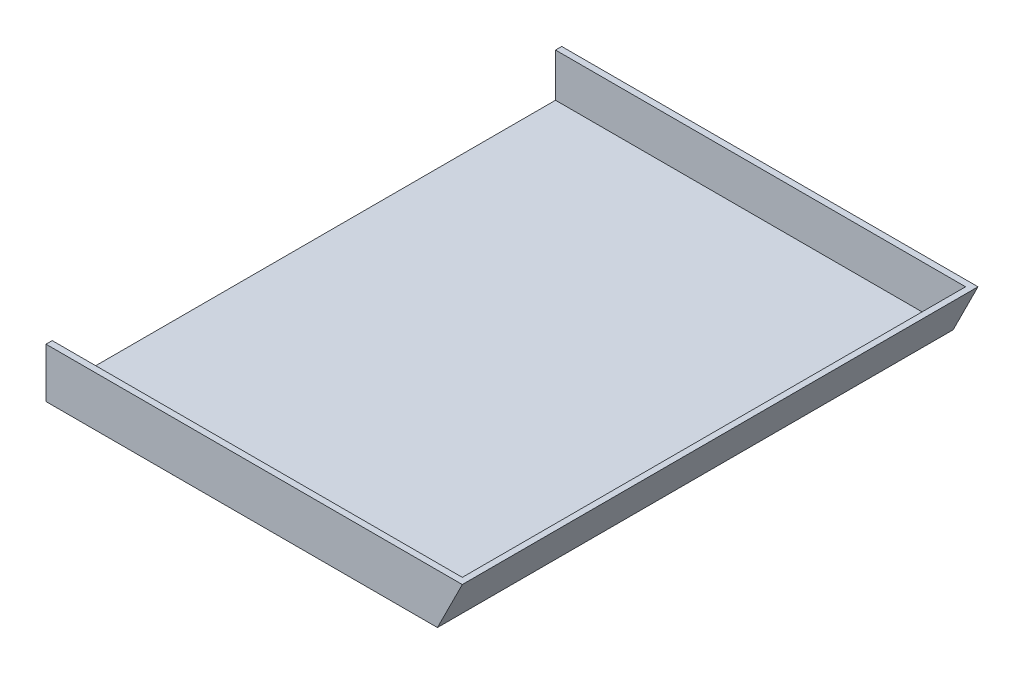
ISO-10303-21;
HEADER;
FILE_DESCRIPTION(('STEP AP214'),'2;1');
FILE_NAME('part.step','',(''),(''),'','','');
FILE_SCHEMA(('AUTOMOTIVE_DESIGN { 1 0 10303 214 1 1 1 1 }'));
ENDSEC;
DATA;
#1=APPLICATION_CONTEXT('core data for automotive mechanical design processes');
#2=APPLICATION_PROTOCOL_DEFINITION('international standard','automotive_design',2000,#1);
#3=PRODUCT_CONTEXT('',#1,'mechanical');
#4=PRODUCT('Part','Part','',(#3));
#5=PRODUCT_RELATED_PRODUCT_CATEGORY('part','',(#4));
#6=PRODUCT_DEFINITION_FORMATION('','',#4);
#7=PRODUCT_DEFINITION_CONTEXT('part definition',#1,'design');
#8=PRODUCT_DEFINITION('design','',#6,#7);
#9=PRODUCT_DEFINITION_SHAPE('','',#8);
#10=(LENGTH_UNIT() NAMED_UNIT(*) SI_UNIT(.MILLI.,.METRE.));
#11=(NAMED_UNIT(*) PLANE_ANGLE_UNIT() SI_UNIT($,.RADIAN.));
#12=(NAMED_UNIT(*) SI_UNIT($,.STERADIAN.) SOLID_ANGLE_UNIT());
#13=UNCERTAINTY_MEASURE_WITH_UNIT(LENGTH_MEASURE(1.E-05),#10,'distance_accuracy_value','');
#14=(GEOMETRIC_REPRESENTATION_CONTEXT(3) GLOBAL_UNCERTAINTY_ASSIGNED_CONTEXT((#13)) GLOBAL_UNIT_ASSIGNED_CONTEXT((#10,
#11,#12)) REPRESENTATION_CONTEXT('',''));
#15=CARTESIAN_POINT('',(0.,0.,0.));
#16=DIRECTION('',(0.,0.,1.));
#17=DIRECTION('',(1.,0.,0.));
#18=AXIS2_PLACEMENT_3D('',#15,#16,#17);
#19=CARTESIAN_POINT('',(3.4,6.49999999999998,44.5));
#20=DIRECTION('',(1.,0.,0.));
#21=DIRECTION('',(0.,0.,-1.));
#22=AXIS2_PLACEMENT_3D('',#19,#20,#21);
#23=PLANE('',#22);
#24=DIRECTION('',(0.,0.,1.));
#25=VECTOR('',#24,1.);
#26=CARTESIAN_POINT('',(3.4,13.5,44.5));
#27=LINE('',#26,#25);
#28=CARTESIAN_POINT('',(3.4,13.5,44.5));
#29=VERTEX_POINT('',#28);
#30=CARTESIAN_POINT('',(3.4,13.5,51.));
#31=VERTEX_POINT('',#30);
#32=EDGE_CURVE('E232',#29,#31,#27,.T.);
#33=ORIENTED_EDGE('',*,*,#32,.T.);
#34=DIRECTION('',(0.,1.,0.));
#35=VECTOR('',#34,1.);
#36=CARTESIAN_POINT('',(3.4,13.5,51.));
#37=LINE('',#36,#35);
#38=CARTESIAN_POINT('',(3.4,6.49999999999998,51.));
#39=VERTEX_POINT('',#38);
#40=EDGE_CURVE('E217',#39,#31,#37,.T.);
#41=ORIENTED_EDGE('',*,*,#40,.F.);
#42=DIRECTION('',(0.,0.,1.));
#43=VECTOR('',#42,1.);
#44=CARTESIAN_POINT('',(3.4,6.49999999999998,44.5));
#45=LINE('',#44,#43);
#46=CARTESIAN_POINT('',(3.4,6.49999999999998,44.5));
#47=VERTEX_POINT('',#46);
#48=EDGE_CURVE('E233',#47,#39,#45,.T.);
#49=ORIENTED_EDGE('',*,*,#48,.F.);
#50=DIRECTION('',(0.,1.,0.));
#51=VECTOR('',#50,1.);
#52=CARTESIAN_POINT('',(3.4,6.49999999999998,44.5));
#53=LINE('',#52,#51);
#54=EDGE_CURVE('E220',#47,#29,#53,.T.);
#55=ORIENTED_EDGE('',*,*,#54,.T.);
#56=EDGE_LOOP('',(#33,#41,#49,#55));
#57=FACE_BOUND('',#56,.T.);
#58=ADVANCED_FACE('F37',(#57),#23,.T.);
#59=CARTESIAN_POINT('',(3.4,6.49999999999998,44.5));
#60=DIRECTION('',(0.,-1.,0.));
#61=DIRECTION('',(0.,0.,-1.));
#62=AXIS2_PLACEMENT_3D('',#59,#60,#61);
#63=PLANE('',#62);
#64=DIRECTION('',(0.,0.,1.));
#65=VECTOR('',#64,1.);
#66=CARTESIAN_POINT('',(2.75,6.49999999999998,49.1));
#67=LINE('',#66,#65);
#68=CARTESIAN_POINT('',(2.75,6.49999999999998,46.4));
#69=VERTEX_POINT('',#68);
#70=CARTESIAN_POINT('',(2.75,6.49999999999998,49.1));
#71=VERTEX_POINT('',#70);
#72=EDGE_CURVE('E53',#69,#71,#67,.T.);
#73=ORIENTED_EDGE('',*,*,#72,.F.);
#74=DIRECTION('',(1.,0.,0.));
#75=VECTOR('',#74,1.);
#76=CARTESIAN_POINT('',(-2.75,6.49999999999998,46.4));
#77=LINE('',#76,#75);
#78=CARTESIAN_POINT('',(-2.75,6.49999999999998,46.4));
#79=VERTEX_POINT('',#78);
#80=EDGE_CURVE('E195',#79,#69,#77,.T.);
#81=ORIENTED_EDGE('',*,*,#80,.F.);
#82=DIRECTION('',(0.,0.,-1.));
#83=VECTOR('',#82,1.);
#84=CARTESIAN_POINT('',(-2.75,6.49999999999998,49.1));
#85=LINE('',#84,#83);
#86=CARTESIAN_POINT('',(-2.75,6.49999999999998,49.1));
#87=VERTEX_POINT('',#86);
#88=EDGE_CURVE('E198',#87,#79,#85,.T.);
#89=ORIENTED_EDGE('',*,*,#88,.F.);
#90=DIRECTION('',(-1.,0.,0.));
#91=VECTOR('',#90,1.);
#92=CARTESIAN_POINT('',(-2.75,6.49999999999998,49.1));
#93=LINE('',#92,#91);
#94=EDGE_CURVE('E204',#71,#87,#93,.T.);
#95=ORIENTED_EDGE('',*,*,#94,.F.);
#96=EDGE_LOOP('',(#73,#81,#89,#95));
#97=FACE_BOUND('',#96,.T.);
#98=ORIENTED_EDGE('',*,*,#48,.T.);
#99=DIRECTION('',(1.,0.,0.));
#100=VECTOR('',#99,1.);
#101=CARTESIAN_POINT('',(-3.4,6.49999999999998,51.));
#102=LINE('',#101,#100);
#103=CARTESIAN_POINT('',(-3.4,6.49999999999998,51.));
#104=VERTEX_POINT('',#103);
#105=EDGE_CURVE('E215',#104,#39,#102,.T.);
#106=ORIENTED_EDGE('',*,*,#105,.F.);
#107=DIRECTION('',(0.,0.,1.));
#108=VECTOR('',#107,1.);
#109=CARTESIAN_POINT('',(-3.4,6.49999999999998,44.5));
#110=LINE('',#109,#108);
#111=CARTESIAN_POINT('',(-3.4,6.49999999999998,44.5));
#112=VERTEX_POINT('',#111);
#113=EDGE_CURVE('E237',#112,#104,#110,.T.);
#114=ORIENTED_EDGE('',*,*,#113,.F.);
#115=DIRECTION('',(1.,0.,0.));
#116=VECTOR('',#115,1.);
#117=CARTESIAN_POINT('',(3.4,6.49999999999998,44.5));
#118=LINE('',#117,#116);
#119=EDGE_CURVE('E229',#112,#47,#118,.T.);
#120=ORIENTED_EDGE('',*,*,#119,.T.);
#121=EDGE_LOOP('',(#98,#106,#114,#120));
#122=FACE_BOUND('',#121,.T.);
#123=ADVANCED_FACE('F406',(#97,#122),#63,.T.);
#124=CARTESIAN_POINT('',(-3.4,6.49999999999998,44.5));
#125=DIRECTION('',(-1.,0.,0.));
#126=DIRECTION('',(0.,0.,1.));
#127=AXIS2_PLACEMENT_3D('',#124,#125,#126);
#128=PLANE('',#127);
#129=ORIENTED_EDGE('',*,*,#113,.T.);
#130=DIRECTION('',(0.,-1.,0.));
#131=VECTOR('',#130,1.);
#132=CARTESIAN_POINT('',(-3.4,13.5,51.));
#133=LINE('',#132,#131);
#134=CARTESIAN_POINT('',(-3.4,13.5,51.));
#135=VERTEX_POINT('',#134);
#136=EDGE_CURVE('E210',#135,#104,#133,.T.);
#137=ORIENTED_EDGE('',*,*,#136,.F.);
#138=DIRECTION('',(0.,0.,1.));
#139=VECTOR('',#138,1.);
#140=CARTESIAN_POINT('',(-3.4,13.5,44.5));
#141=LINE('',#140,#139);
#142=CARTESIAN_POINT('',(-3.4,13.5,44.5));
#143=VERTEX_POINT('',#142);
#144=EDGE_CURVE('E240',#143,#135,#141,.T.);
#145=ORIENTED_EDGE('',*,*,#144,.F.);
#146=DIRECTION('',(0.,-1.,0.));
#147=VECTOR('',#146,1.);
#148=CARTESIAN_POINT('',(-3.4,6.49999999999998,44.5));
#149=LINE('',#148,#147);
#150=EDGE_CURVE('E226',#143,#112,#149,.T.);
#151=ORIENTED_EDGE('',*,*,#150,.T.);
#152=EDGE_LOOP('',(#129,#137,#145,#151));
#153=FACE_BOUND('',#152,.T.);
#154=ADVANCED_FACE('F411',(#153),#128,.T.);
#155=CARTESIAN_POINT('',(-3.4,0.,83.));
#156=DIRECTION('',(-1.,0.,0.));
#157=DIRECTION('',(0.,-1.,0.));
#158=AXIS2_PLACEMENT_3D('',#155,#156,#157);
#159=PLANE('',#158);
#160=DIRECTION('',(0.,0.,-1.));
#161=VECTOR('',#160,1.);
#162=CARTESIAN_POINT('',(-3.4,0.,83.));
#163=LINE('',#162,#161);
#164=CARTESIAN_POINT('',(-3.4,0.,4.));
#165=VERTEX_POINT('',#164);
#166=CARTESIAN_POINT('',(-3.4,0.,0.));
#167=VERTEX_POINT('',#166);
#168=EDGE_CURVE('E321',#165,#167,#163,.T.);
#169=ORIENTED_EDGE('',*,*,#168,.F.);
#170=DIRECTION('',(0.,-1.,0.));
#171=VECTOR('',#170,1.);
#172=CARTESIAN_POINT('',(-3.4,13.5,4.));
#173=LINE('',#172,#171);
#174=CARTESIAN_POINT('',(-3.4,13.5,4.));
#175=VERTEX_POINT('',#174);
#176=EDGE_CURVE('E236',#175,#165,#173,.T.);
#177=ORIENTED_EDGE('',*,*,#176,.F.);
#178=DIRECTION('',(0.,0.,-1.));
#179=VECTOR('',#178,1.);
#180=CARTESIAN_POINT('',(-3.4,13.5,83.));
#181=LINE('',#180,#179);
#182=CARTESIAN_POINT('',(-3.4,13.5,0.));
#183=VERTEX_POINT('',#182);
#184=EDGE_CURVE('E323',#175,#183,#181,.T.);
#185=ORIENTED_EDGE('',*,*,#184,.T.);
#186=DIRECTION('',(0.,1.,0.));
#187=VECTOR('',#186,1.);
#188=CARTESIAN_POINT('',(-3.4,0.,0.));
#189=LINE('',#188,#187);
#190=EDGE_CURVE('E297',#167,#183,#189,.T.);
#191=ORIENTED_EDGE('',*,*,#190,.F.);
#192=EDGE_LOOP('',(#169,#177,#185,#191));
#193=FACE_BOUND('',#192,.T.);
#194=ADVANCED_FACE('F387',(#193),#159,.T.);
#195=CARTESIAN_POINT('',(0.,0.,83.));
#196=DIRECTION('',(0.,0.,-1.));
#197=DIRECTION('',(-1.,0.,0.));
#198=AXIS2_PLACEMENT_3D('',#195,#196,#197);
#199=CYLINDRICAL_SURFACE('',#198,3.4);
#200=CARTESIAN_POINT('',(0.,0.,4.));
#201=DIRECTION('',(0.,0.,1.));
#202=DIRECTION('',(1.,0.,0.));
#203=AXIS2_PLACEMENT_3D('',#200,#201,#202);
#204=CIRCLE('',#203,3.4);
#205=CARTESIAN_POINT('',(3.4,0.,4.));
#206=VERTEX_POINT('',#205);
#207=EDGE_CURVE('E250',#165,#206,#204,.T.);
#208=ORIENTED_EDGE('',*,*,#207,.F.);
#209=ORIENTED_EDGE('',*,*,#168,.T.);
#210=CARTESIAN_POINT('',(0.,0.,0.));
#211=DIRECTION('',(0.,0.,1.));
#212=DIRECTION('',(1.,0.,0.));
#213=AXIS2_PLACEMENT_3D('',#210,#211,#212);
#214=CIRCLE('',#213,3.4);
#215=CARTESIAN_POINT('',(3.4,0.,0.));
#216=VERTEX_POINT('',#215);
#217=EDGE_CURVE('E300',#167,#216,#214,.T.);
#218=ORIENTED_EDGE('',*,*,#217,.T.);
#219=DIRECTION('',(0.,0.,-1.));
#220=VECTOR('',#219,1.);
#221=CARTESIAN_POINT('',(3.4,0.,83.));
#222=LINE('',#221,#220);
#223=EDGE_CURVE('E319',#206,#216,#222,.T.);
#224=ORIENTED_EDGE('',*,*,#223,.F.);
#225=EDGE_LOOP('',(#208,#209,#218,#224));
#226=FACE_BOUND('',#225,.T.);
#227=ADVANCED_FACE('F383',(#226),#199,.T.);
#228=CARTESIAN_POINT('',(3.4,0.,83.));
#229=DIRECTION('',(1.,0.,0.));
#230=DIRECTION('',(0.,1.,0.));
#231=AXIS2_PLACEMENT_3D('',#228,#229,#230);
#232=PLANE('',#231);
#233=DIRECTION('',(0.,0.,-1.));
#234=VECTOR('',#233,1.);
#235=CARTESIAN_POINT('',(3.4,13.5,83.));
#236=LINE('',#235,#234);
#237=CARTESIAN_POINT('',(3.4,13.5,4.));
#238=VERTEX_POINT('',#237);
#239=CARTESIAN_POINT('',(3.4,13.5,0.));
#240=VERTEX_POINT('',#239);
#241=EDGE_CURVE('E317',#238,#240,#236,.T.);
#242=ORIENTED_EDGE('',*,*,#241,.F.);
#243=DIRECTION('',(0.,1.,0.));
#244=VECTOR('',#243,1.);
#245=CARTESIAN_POINT('',(3.4,13.5,4.));
#246=LINE('',#245,#244);
#247=EDGE_CURVE('E246',#206,#238,#246,.T.);
#248=ORIENTED_EDGE('',*,*,#247,.F.);
#249=ORIENTED_EDGE('',*,*,#223,.T.);
#250=DIRECTION('',(0.,-1.,0.));
#251=VECTOR('',#250,1.);
#252=CARTESIAN_POINT('',(3.4,0.,0.));
#253=LINE('',#252,#251);
#254=EDGE_CURVE('E303',#240,#216,#253,.T.);
#255=ORIENTED_EDGE('',*,*,#254,.F.);
#256=EDGE_LOOP('',(#242,#248,#249,#255));
#257=FACE_BOUND('',#256,.T.);
#258=ADVANCED_FACE('F378',(#257),#232,.T.);
#259=CARTESIAN_POINT('',(0.,0.,83.));
#260=DIRECTION('',(0.,0.,-1.));
#261=DIRECTION('',(-1.,0.,0.));
#262=AXIS2_PLACEMENT_3D('',#259,#260,#261);
#263=CYLINDRICAL_SURFACE('',#262,1.5);
#264=CARTESIAN_POINT('',(0.,0.,0.));
#265=DIRECTION('',(0.,0.,1.));
#266=DIRECTION('',(1.,0.,0.));
#267=AXIS2_PLACEMENT_3D('',#264,#265,#266);
#268=CIRCLE('',#267,1.5);
#269=CARTESIAN_POINT('',(1.5,0.,0.));
#270=VERTEX_POINT('',#269);
#271=EDGE_CURVE('E283',#270,#270,#268,.T.);
#272=ORIENTED_EDGE('',*,*,#271,.F.);
#273=EDGE_LOOP('',(#272));
#274=FACE_BOUND('',#273,.T.);
#275=CARTESIAN_POINT('',(0.,0.,4.));
#276=DIRECTION('',(0.,0.,1.));
#277=DIRECTION('',(1.,0.,0.));
#278=AXIS2_PLACEMENT_3D('',#275,#276,#277);
#279=CIRCLE('',#278,1.5);
#280=CARTESIAN_POINT('',(1.5,0.,4.));
#281=VERTEX_POINT('',#280);
#282=EDGE_CURVE('E41',#281,#281,#279,.T.);
#283=ORIENTED_EDGE('',*,*,#282,.T.);
#284=EDGE_LOOP('',(#283));
#285=FACE_BOUND('',#284,.T.);
#286=ADVANCED_FACE('F558',(#274,#285),#263,.F.);
#287=CARTESIAN_POINT('',(17.4,-8.7,83.));
#288=DIRECTION('',(-0.894427190999916,0.447213595499958,0.));
#289=DIRECTION('',(-0.447213595499959,-0.894427190999916,0.));
#290=AXIS2_PLACEMENT_3D('',#287,#288,#289);
#291=PLANE('',#290);
#292=DIRECTION('',(0.,0.,-1.));
#293=VECTOR('',#292,1.);
#294=CARTESIAN_POINT('',(32.5,21.5,83.));
#295=LINE('',#294,#293);
#296=CARTESIAN_POINT('',(32.5,21.5,82.));
#297=VERTEX_POINT('',#296);
#298=CARTESIAN_POINT('',(32.5,21.5,1.));
#299=VERTEX_POINT('',#298);
#300=EDGE_CURVE('E11',#297,#299,#295,.T.);
#301=ORIENTED_EDGE('',*,*,#300,.T.);
#302=DIRECTION('',(-0.447213595499959,-0.894427190999916,0.));
#303=VECTOR('',#302,1.);
#304=CARTESIAN_POINT('',(17.4,-8.7,1.));
#305=LINE('',#304,#303);
#306=CARTESIAN_POINT('',(29.,14.5,1.));
#307=VERTEX_POINT('',#306);
#308=EDGE_CURVE('E257',#299,#307,#305,.T.);
#309=ORIENTED_EDGE('',*,*,#308,.T.);
#310=DIRECTION('',(0.,0.,-1.));
#311=VECTOR('',#310,1.);
#312=CARTESIAN_POINT('',(29.,14.5,83.));
#313=LINE('',#312,#311);
#314=CARTESIAN_POINT('',(29.,14.5,82.));
#315=VERTEX_POINT('',#314);
#316=EDGE_CURVE('E46',#315,#307,#313,.T.);
#317=ORIENTED_EDGE('',*,*,#316,.F.);
#318=DIRECTION('',(-0.447213595499959,-0.894427190999916,0.));
#319=VECTOR('',#318,1.);
#320=CARTESIAN_POINT('',(17.4,-8.7,82.));
#321=LINE('',#320,#319);
#322=EDGE_CURVE('E276',#297,#315,#321,.T.);
#323=ORIENTED_EDGE('',*,*,#322,.F.);
#324=EDGE_LOOP('',(#301,#309,#317,#323));
#325=FACE_BOUND('',#324,.T.);
#326=ADVANCED_FACE('F338',(#325),#291,.T.);
#327=CARTESIAN_POINT('',(0.,14.5,83.));
#328=DIRECTION('',(0.,1.,0.));
#329=DIRECTION('',(0.,0.,1.));
#330=AXIS2_PLACEMENT_3D('',#327,#328,#329);
#331=PLANE('',#330);
#332=ORIENTED_EDGE('',*,*,#316,.T.);
#333=DIRECTION('',(1.,0.,0.));
#334=VECTOR('',#333,1.);
#335=CARTESIAN_POINT('',(-33.5,14.5,1.));
#336=LINE('',#335,#334);
#337=CARTESIAN_POINT('',(-33.5,14.5,1.));
#338=VERTEX_POINT('',#337);
#339=EDGE_CURVE('E255',#338,#307,#336,.T.);
#340=ORIENTED_EDGE('',*,*,#339,.F.);
#341=DIRECTION('',(0.,0.,-1.));
#342=VECTOR('',#341,1.);
#343=CARTESIAN_POINT('',(-33.5,14.5,83.));
#344=LINE('',#343,#342);
#345=CARTESIAN_POINT('',(-33.5,14.5,82.));
#346=VERTEX_POINT('',#345);
#347=EDGE_CURVE('E328',#346,#338,#344,.T.);
#348=ORIENTED_EDGE('',*,*,#347,.F.);
#349=DIRECTION('',(1.,0.,0.));
#350=VECTOR('',#349,1.);
#351=CARTESIAN_POINT('',(0.,14.5,82.));
#352=LINE('',#351,#350);
#353=EDGE_CURVE('E265',#346,#315,#352,.T.);
#354=ORIENTED_EDGE('',*,*,#353,.T.);
#355=EDGE_LOOP('',(#332,#340,#348,#354));
#356=FACE_BOUND('',#355,.T.);
#357=ADVANCED_FACE('F335',(#356),#331,.T.);
#358=CARTESIAN_POINT('',(18.2,-9.1,83.));
#359=DIRECTION('',(0.894427190999916,-0.447213595499958,0.));
#360=DIRECTION('',(0.447213595499958,0.894427190999916,0.));
#361=AXIS2_PLACEMENT_3D('',#358,#359,#360);
#362=PLANE('',#361);
#363=DIRECTION('',(-0.447213595499958,-0.894427190999916,0.));
#364=VECTOR('',#363,1.);
#365=CARTESIAN_POINT('',(18.2,-9.1,0.));
#366=LINE('',#365,#364);
#367=CARTESIAN_POINT('',(33.5,21.5,0.));
#368=VERTEX_POINT('',#367);
#369=CARTESIAN_POINT('',(29.5,13.5,0.));
#370=VERTEX_POINT('',#369);
#371=EDGE_CURVE('E309',#368,#370,#366,.T.);
#372=ORIENTED_EDGE('',*,*,#371,.F.);
#373=DIRECTION('',(0.,0.,-1.));
#374=VECTOR('',#373,1.);
#375=CARTESIAN_POINT('',(33.5,21.5,83.));
#376=LINE('',#375,#374);
#377=CARTESIAN_POINT('',(33.5,21.5,83.));
#378=VERTEX_POINT('',#377);
#379=EDGE_CURVE('E290',#378,#368,#376,.T.);
#380=ORIENTED_EDGE('',*,*,#379,.F.);
#381=DIRECTION('',(-0.447213595499958,-0.894427190999916,0.));
#382=VECTOR('',#381,1.);
#383=CARTESIAN_POINT('',(18.2,-9.1,83.));
#384=LINE('',#383,#382);
#385=CARTESIAN_POINT('',(29.5,13.5,83.));
#386=VERTEX_POINT('',#385);
#387=EDGE_CURVE('E287',#378,#386,#384,.T.);
#388=ORIENTED_EDGE('',*,*,#387,.T.);
#389=DIRECTION('',(0.,0.,-1.));
#390=VECTOR('',#389,1.);
#391=CARTESIAN_POINT('',(29.5,13.5,83.));
#392=LINE('',#391,#390);
#393=EDGE_CURVE('E314',#386,#370,#392,.T.);
#394=ORIENTED_EDGE('',*,*,#393,.T.);
#395=EDGE_LOOP('',(#372,#380,#388,#394));
#396=FACE_BOUND('',#395,.T.);
#397=ADVANCED_FACE('F362',(#396),#362,.T.);
#398=CARTESIAN_POINT('',(-1.49186218934004E-13,21.4999999999998,83.));
#399=DIRECTION('',(0.,-1.,0.));
#400=DIRECTION('',(1.,0.,0.));
#401=AXIS2_PLACEMENT_3D('',#398,#399,#400);
#402=PLANE('',#401);
#403=DIRECTION('',(-1.,0.,0.));
#404=VECTOR('',#403,1.);
#405=CARTESIAN_POINT('',(-1.49186218934004E-13,21.4999999999998,0.));
#406=LINE('',#405,#404);
#407=CARTESIAN_POINT('',(-33.5,21.5,0.));
#408=VERTEX_POINT('',#407);
#409=EDGE_CURVE('E279',#368,#408,#406,.T.);
#410=ORIENTED_EDGE('',*,*,#409,.T.);
#411=DIRECTION('',(0.,0.,1.));
#412=VECTOR('',#411,1.);
#413=CARTESIAN_POINT('',(-33.5,21.5,0.));
#414=LINE('',#413,#412);
#415=CARTESIAN_POINT('',(-33.5,21.5,1.));
#416=VERTEX_POINT('',#415);
#417=EDGE_CURVE('E258',#408,#416,#414,.T.);
#418=ORIENTED_EDGE('',*,*,#417,.T.);
#419=DIRECTION('',(1.,0.,0.));
#420=VECTOR('',#419,1.);
#421=CARTESIAN_POINT('',(-33.5,21.5,1.));
#422=LINE('',#421,#420);
#423=EDGE_CURVE('E254',#416,#299,#422,.T.);
#424=ORIENTED_EDGE('',*,*,#423,.T.);
#425=ORIENTED_EDGE('',*,*,#300,.F.);
#426=DIRECTION('',(1.,0.,0.));
#427=VECTOR('',#426,1.);
#428=CARTESIAN_POINT('',(0.,21.5,82.));
#429=LINE('',#428,#427);
#430=CARTESIAN_POINT('',(-33.5,21.5,82.));
#431=VERTEX_POINT('',#430);
#432=EDGE_CURVE('E266',#431,#297,#429,.T.);
#433=ORIENTED_EDGE('',*,*,#432,.F.);
#434=DIRECTION('',(0.,0.,1.));
#435=VECTOR('',#434,1.);
#436=CARTESIAN_POINT('',(-33.5,21.5,0.));
#437=LINE('',#436,#435);
#438=CARTESIAN_POINT('',(-33.5,21.5,83.));
#439=VERTEX_POINT('',#438);
#440=EDGE_CURVE('E269',#431,#439,#437,.T.);
#441=ORIENTED_EDGE('',*,*,#440,.T.);
#442=DIRECTION('',(-1.,0.,0.));
#443=VECTOR('',#442,1.);
#444=CARTESIAN_POINT('',(-1.49186218934004E-13,21.4999999999998,83.));
#445=LINE('',#444,#443);
#446=EDGE_CURVE('E280',#378,#439,#445,.T.);
#447=ORIENTED_EDGE('',*,*,#446,.F.);
#448=ORIENTED_EDGE('',*,*,#379,.T.);
#449=EDGE_LOOP('',(#410,#418,#424,#425,#433,#441,#447,#448));
#450=FACE_BOUND('',#449,.T.);
#451=ADVANCED_FACE('F39',(#450),#402,.F.);
#452=CARTESIAN_POINT('',(-33.5,0.,83.));
#453=DIRECTION('',(1.,0.,0.));
#454=DIRECTION('',(0.,0.,-1.));
#455=AXIS2_PLACEMENT_3D('',#452,#453,#454);
#456=PLANE('',#455);
#457=DIRECTION('',(0.,-1.,0.));
#458=VECTOR('',#457,1.);
#459=CARTESIAN_POINT('',(-33.5,0.,0.));
#460=LINE('',#459,#458);
#461=CARTESIAN_POINT('',(-33.5,13.5,0.));
#462=VERTEX_POINT('',#461);
#463=EDGE_CURVE('E292',#408,#462,#460,.T.);
#464=ORIENTED_EDGE('',*,*,#463,.T.);
#465=DIRECTION('',(0.,0.,-1.));
#466=VECTOR('',#465,1.);
#467=CARTESIAN_POINT('',(-33.5,13.5,83.));
#468=LINE('',#467,#466);
#469=CARTESIAN_POINT('',(-33.5,13.5,83.));
#470=VERTEX_POINT('',#469);
#471=EDGE_CURVE('E325',#470,#462,#468,.T.);
#472=ORIENTED_EDGE('',*,*,#471,.F.);
#473=DIRECTION('',(0.,-1.,0.));
#474=VECTOR('',#473,1.);
#475=CARTESIAN_POINT('',(-33.5,0.,83.));
#476=LINE('',#475,#474);
#477=EDGE_CURVE('E282',#439,#470,#476,.T.);
#478=ORIENTED_EDGE('',*,*,#477,.F.);
#479=ORIENTED_EDGE('',*,*,#440,.F.);
#480=DIRECTION('',(0.,-1.,0.));
#481=VECTOR('',#480,1.);
#482=CARTESIAN_POINT('',(-33.5,21.5,82.));
#483=LINE('',#482,#481);
#484=EDGE_CURVE('E272',#431,#346,#483,.T.);
#485=ORIENTED_EDGE('',*,*,#484,.T.);
#486=ORIENTED_EDGE('',*,*,#347,.T.);
#487=DIRECTION('',(0.,-1.,0.));
#488=VECTOR('',#487,1.);
#489=CARTESIAN_POINT('',(-33.5,21.5,1.));
#490=LINE('',#489,#488);
#491=EDGE_CURVE('E252',#416,#338,#490,.T.);
#492=ORIENTED_EDGE('',*,*,#491,.F.);
#493=ORIENTED_EDGE('',*,*,#417,.F.);
#494=EDGE_LOOP('',(#464,#472,#478,#479,#485,#486,#492,#493));
#495=FACE_BOUND('',#494,.T.);
#496=ADVANCED_FACE('F351',(#495),#456,.F.);
#497=CARTESIAN_POINT('',(0.,13.5,83.));
#498=DIRECTION('',(0.,1.,0.));
#499=DIRECTION('',(0.,0.,1.));
#500=AXIS2_PLACEMENT_3D('',#497,#498,#499);
#501=PLANE('',#500);
#502=ORIENTED_EDGE('',*,*,#393,.F.);
#503=DIRECTION('',(1.,0.,0.));
#504=VECTOR('',#503,1.);
#505=CARTESIAN_POINT('',(0.,13.5,83.));
#506=LINE('',#505,#504);
#507=EDGE_CURVE('E285',#470,#386,#506,.T.);
#508=ORIENTED_EDGE('',*,*,#507,.F.);
#509=ORIENTED_EDGE('',*,*,#471,.T.);
#510=DIRECTION('',(1.,0.,0.));
#511=VECTOR('',#510,1.);
#512=CARTESIAN_POINT('',(0.,13.5,0.));
#513=LINE('',#512,#511);
#514=EDGE_CURVE('E294',#462,#183,#513,.T.);
#515=ORIENTED_EDGE('',*,*,#514,.T.);
#516=ORIENTED_EDGE('',*,*,#184,.F.);
#517=DIRECTION('',(-1.,0.,0.));
#518=VECTOR('',#517,1.);
#519=CARTESIAN_POINT('',(-3.4,13.5,4.));
#520=LINE('',#519,#518);
#521=EDGE_CURVE('E248',#238,#175,#520,.T.);
#522=ORIENTED_EDGE('',*,*,#521,.F.);
#523=ORIENTED_EDGE('',*,*,#241,.T.);
#524=DIRECTION('',(1.,0.,0.));
#525=VECTOR('',#524,1.);
#526=CARTESIAN_POINT('',(0.,13.5,0.));
#527=LINE('',#526,#525);
#528=EDGE_CURVE('E306',#240,#370,#527,.T.);
#529=ORIENTED_EDGE('',*,*,#528,.T.);
#530=EDGE_LOOP('',(#502,#508,#509,#515,#516,#522,#523,#529));
#531=FACE_BOUND('',#530,.T.);
#532=DIRECTION('',(-1.,0.,0.));
#533=VECTOR('',#532,1.);
#534=CARTESIAN_POINT('',(-3.4,13.5,51.));
#535=LINE('',#534,#533);
#536=EDGE_CURVE('E61',#31,#135,#535,.T.);
#537=ORIENTED_EDGE('',*,*,#536,.F.);
#538=ORIENTED_EDGE('',*,*,#32,.F.);
#539=DIRECTION('',(-1.,0.,0.));
#540=VECTOR('',#539,1.);
#541=CARTESIAN_POINT('',(3.4,13.5,44.5));
#542=LINE('',#541,#540);
#543=EDGE_CURVE('E223',#29,#143,#542,.T.);
#544=ORIENTED_EDGE('',*,*,#543,.T.);
#545=ORIENTED_EDGE('',*,*,#144,.T.);
#546=EDGE_LOOP('',(#537,#538,#544,#545));
#547=FACE_BOUND('',#546,.T.);
#548=ADVANCED_FACE('F370',(#531,#547),#501,.F.);
#549=CARTESIAN_POINT('',(0.,0.,83.));
#550=DIRECTION('',(0.,0.,1.));
#551=DIRECTION('',(1.,0.,0.));
#552=AXIS2_PLACEMENT_3D('',#549,#550,#551);
#553=PLANE('',#552);
#554=ORIENTED_EDGE('',*,*,#507,.T.);
#555=ORIENTED_EDGE('',*,*,#387,.F.);
#556=ORIENTED_EDGE('',*,*,#446,.T.);
#557=ORIENTED_EDGE('',*,*,#477,.T.);
#558=EDGE_LOOP('',(#554,#555,#556,#557));
#559=FACE_BOUND('',#558,.T.);
#560=ADVANCED_FACE('F356',(#559),#553,.T.);
#561=CARTESIAN_POINT('',(0.,0.,0.));
#562=DIRECTION('',(0.,0.,1.));
#563=DIRECTION('',(1.,0.,0.));
#564=AXIS2_PLACEMENT_3D('',#561,#562,#563);
#565=PLANE('',#564);
#566=ORIENTED_EDGE('',*,*,#409,.F.);
#567=ORIENTED_EDGE('',*,*,#371,.T.);
#568=ORIENTED_EDGE('',*,*,#528,.F.);
#569=ORIENTED_EDGE('',*,*,#254,.T.);
#570=ORIENTED_EDGE('',*,*,#217,.F.);
#571=ORIENTED_EDGE('',*,*,#190,.T.);
#572=ORIENTED_EDGE('',*,*,#514,.F.);
#573=ORIENTED_EDGE('',*,*,#463,.F.);
#574=EDGE_LOOP('',(#566,#567,#568,#569,#570,#571,#572,#573));
#575=FACE_BOUND('',#574,.T.);
#576=ORIENTED_EDGE('',*,*,#271,.T.);
#577=EDGE_LOOP('',(#576));
#578=FACE_BOUND('',#577,.T.);
#579=ADVANCED_FACE('F366',(#575,#578),#565,.F.);
#580=CARTESIAN_POINT('',(0.,21.5,82.));
#581=DIRECTION('',(0.,0.,-1.));
#582=DIRECTION('',(-1.,0.,0.));
#583=AXIS2_PLACEMENT_3D('',#580,#581,#582);
#584=PLANE('',#583);
#585=ORIENTED_EDGE('',*,*,#432,.T.);
#586=ORIENTED_EDGE('',*,*,#322,.T.);
#587=ORIENTED_EDGE('',*,*,#353,.F.);
#588=ORIENTED_EDGE('',*,*,#484,.F.);
#589=EDGE_LOOP('',(#585,#586,#587,#588));
#590=FACE_BOUND('',#589,.T.);
#591=ADVANCED_FACE('F341',(#590),#584,.T.);
#592=CARTESIAN_POINT('',(-33.5,21.5,1.));
#593=DIRECTION('',(0.,0.,-1.));
#594=DIRECTION('',(-1.,0.,0.));
#595=AXIS2_PLACEMENT_3D('',#592,#593,#594);
#596=PLANE('',#595);
#597=ORIENTED_EDGE('',*,*,#308,.F.);
#598=ORIENTED_EDGE('',*,*,#423,.F.);
#599=ORIENTED_EDGE('',*,*,#491,.T.);
#600=ORIENTED_EDGE('',*,*,#339,.T.);
#601=EDGE_LOOP('',(#597,#598,#599,#600));
#602=FACE_BOUND('',#601,.T.);
#603=ADVANCED_FACE('F349',(#602),#596,.F.);
#604=CARTESIAN_POINT('',(0.,0.,4.));
#605=DIRECTION('',(0.,0.,1.));
#606=DIRECTION('',(1.,0.,0.));
#607=AXIS2_PLACEMENT_3D('',#604,#605,#606);
#608=PLANE('',#607);
#609=ORIENTED_EDGE('',*,*,#282,.F.);
#610=EDGE_LOOP('',(#609));
#611=FACE_BOUND('',#610,.T.);
#612=ORIENTED_EDGE('',*,*,#207,.T.);
#613=ORIENTED_EDGE('',*,*,#247,.T.);
#614=ORIENTED_EDGE('',*,*,#521,.T.);
#615=ORIENTED_EDGE('',*,*,#176,.T.);
#616=EDGE_LOOP('',(#612,#613,#614,#615));
#617=FACE_BOUND('',#616,.T.);
#618=ADVANCED_FACE('F390',(#611,#617),#608,.T.);
#619=CARTESIAN_POINT('',(0.,0.,44.5));
#620=DIRECTION('',(0.,0.,1.));
#621=DIRECTION('',(1.,0.,0.));
#622=AXIS2_PLACEMENT_3D('',#619,#620,#621);
#623=PLANE('',#622);
#624=ORIENTED_EDGE('',*,*,#54,.F.);
#625=ORIENTED_EDGE('',*,*,#119,.F.);
#626=ORIENTED_EDGE('',*,*,#150,.F.);
#627=ORIENTED_EDGE('',*,*,#543,.F.);
#628=EDGE_LOOP('',(#624,#625,#626,#627));
#629=FACE_BOUND('',#628,.T.);
#630=ADVANCED_FACE('F392',(#629),#623,.F.);
#631=CARTESIAN_POINT('',(0.,0.,51.));
#632=DIRECTION('',(0.,0.,1.));
#633=DIRECTION('',(1.,0.,0.));
#634=AXIS2_PLACEMENT_3D('',#631,#632,#633);
#635=PLANE('',#634);
#636=ORIENTED_EDGE('',*,*,#136,.T.);
#637=ORIENTED_EDGE('',*,*,#105,.T.);
#638=ORIENTED_EDGE('',*,*,#40,.T.);
#639=ORIENTED_EDGE('',*,*,#536,.T.);
#640=EDGE_LOOP('',(#636,#637,#638,#639));
#641=FACE_BOUND('',#640,.T.);
#642=ADVANCED_FACE('F399',(#641),#635,.T.);
#643=CARTESIAN_POINT('',(2.75,13.5,49.1));
#644=DIRECTION('',(1.,0.,0.));
#645=DIRECTION('',(0.,0.,-1.));
#646=AXIS2_PLACEMENT_3D('',#643,#644,#645);
#647=PLANE('',#646);
#648=ORIENTED_EDGE('',*,*,#72,.T.);
#649=DIRECTION('',(0.,-1.,0.));
#650=VECTOR('',#649,1.);
#651=CARTESIAN_POINT('',(2.75,13.5,49.1));
#652=LINE('',#651,#650);
#653=CARTESIAN_POINT('',(2.75,13.5,49.1));
#654=VERTEX_POINT('',#653);
#655=EDGE_CURVE('E173',#654,#71,#652,.T.);
#656=ORIENTED_EDGE('',*,*,#655,.F.);
#657=DIRECTION('',(0.,0.,1.));
#658=VECTOR('',#657,1.);
#659=CARTESIAN_POINT('',(2.75,13.5,49.1));
#660=LINE('',#659,#658);
#661=CARTESIAN_POINT('',(2.75,13.5,46.4));
#662=VERTEX_POINT('',#661);
#663=EDGE_CURVE('E177',#662,#654,#660,.T.);
#664=ORIENTED_EDGE('',*,*,#663,.F.);
#665=DIRECTION('',(0.,-1.,0.));
#666=VECTOR('',#665,1.);
#667=CARTESIAN_POINT('',(2.75,13.5,46.4));
#668=LINE('',#667,#666);
#669=EDGE_CURVE('E208',#662,#69,#668,.T.);
#670=ORIENTED_EDGE('',*,*,#669,.T.);
#671=EDGE_LOOP('',(#648,#656,#664,#670));
#672=FACE_BOUND('',#671,.T.);
#673=ADVANCED_FACE('F175',(#672),#647,.F.);
#674=CARTESIAN_POINT('',(-2.75,13.5,46.4));
#675=DIRECTION('',(0.,0.,-1.));
#676=DIRECTION('',(-1.,0.,0.));
#677=AXIS2_PLACEMENT_3D('',#674,#675,#676);
#678=PLANE('',#677);
#679=ORIENTED_EDGE('',*,*,#80,.T.);
#680=ORIENTED_EDGE('',*,*,#669,.F.);
#681=DIRECTION('',(1.,0.,0.));
#682=VECTOR('',#681,1.);
#683=CARTESIAN_POINT('',(-2.75,13.5,46.4));
#684=LINE('',#683,#682);
#685=CARTESIAN_POINT('',(-2.75,13.5,46.4));
#686=VERTEX_POINT('',#685);
#687=EDGE_CURVE('E183',#686,#662,#684,.T.);
#688=ORIENTED_EDGE('',*,*,#687,.F.);
#689=DIRECTION('',(0.,-1.,0.));
#690=VECTOR('',#689,1.);
#691=CARTESIAN_POINT('',(-2.75,13.5,46.4));
#692=LINE('',#691,#690);
#693=EDGE_CURVE('E211',#686,#79,#692,.T.);
#694=ORIENTED_EDGE('',*,*,#693,.T.);
#695=EDGE_LOOP('',(#679,#680,#688,#694));
#696=FACE_BOUND('',#695,.T.);
#697=ADVANCED_FACE('F422',(#696),#678,.F.);
#698=CARTESIAN_POINT('',(-2.75,13.5,49.1));
#699=DIRECTION('',(-1.,0.,0.));
#700=DIRECTION('',(0.,0.,1.));
#701=AXIS2_PLACEMENT_3D('',#698,#699,#700);
#702=PLANE('',#701);
#703=ORIENTED_EDGE('',*,*,#88,.T.);
#704=ORIENTED_EDGE('',*,*,#693,.F.);
#705=DIRECTION('',(0.,0.,-1.));
#706=VECTOR('',#705,1.);
#707=CARTESIAN_POINT('',(-2.75,13.5,49.1));
#708=LINE('',#707,#706);
#709=CARTESIAN_POINT('',(-2.75,13.5,49.1));
#710=VERTEX_POINT('',#709);
#711=EDGE_CURVE('E191',#710,#686,#708,.T.);
#712=ORIENTED_EDGE('',*,*,#711,.F.);
#713=DIRECTION('',(0.,-1.,0.));
#714=VECTOR('',#713,1.);
#715=CARTESIAN_POINT('',(-2.75,13.5,49.1));
#716=LINE('',#715,#714);
#717=EDGE_CURVE('E182',#710,#87,#716,.T.);
#718=ORIENTED_EDGE('',*,*,#717,.T.);
#719=EDGE_LOOP('',(#703,#704,#712,#718));
#720=FACE_BOUND('',#719,.T.);
#721=ADVANCED_FACE('F425',(#720),#702,.F.);
#722=CARTESIAN_POINT('',(-2.75,13.5,49.1));
#723=DIRECTION('',(0.,0.,1.));
#724=DIRECTION('',(1.,0.,0.));
#725=AXIS2_PLACEMENT_3D('',#722,#723,#724);
#726=PLANE('',#725);
#727=ORIENTED_EDGE('',*,*,#94,.T.);
#728=ORIENTED_EDGE('',*,*,#717,.F.);
#729=DIRECTION('',(-1.,0.,0.));
#730=VECTOR('',#729,1.);
#731=CARTESIAN_POINT('',(-2.75,13.5,49.1));
#732=LINE('',#731,#730);
#733=EDGE_CURVE('E186',#654,#710,#732,.T.);
#734=ORIENTED_EDGE('',*,*,#733,.F.);
#735=ORIENTED_EDGE('',*,*,#655,.T.);
#736=EDGE_LOOP('',(#727,#728,#734,#735));
#737=FACE_BOUND('',#736,.T.);
#738=ADVANCED_FACE('F187',(#737),#726,.F.);
#739=CARTESIAN_POINT('',(0.,13.5,0.));
#740=DIRECTION('',(0.,-1.,0.));
#741=DIRECTION('',(0.,0.,-1.));
#742=AXIS2_PLACEMENT_3D('',#739,#740,#741);
#743=PLANE('',#742);
#744=ORIENTED_EDGE('',*,*,#663,.T.);
#745=ORIENTED_EDGE('',*,*,#733,.T.);
#746=ORIENTED_EDGE('',*,*,#711,.T.);
#747=ORIENTED_EDGE('',*,*,#687,.T.);
#748=EDGE_LOOP('',(#744,#745,#746,#747));
#749=FACE_BOUND('',#748,.T.);
#750=ADVANCED_FACE('F193',(#749),#743,.T.);
#751=CLOSED_SHELL('',(#58,#123,#154,#194,#227,#258,#286,#326,#357,#397,#451,#496,#548,#560,#579,
#591,#603,#618,#630,#642,#673,#697,#721,#738,#750));
#752=MANIFOLD_SOLID_BREP('B2',#751);
#753=ADVANCED_BREP_SHAPE_REPRESENTATION('',(#18,#752),#14);
#754=SHAPE_DEFINITION_REPRESENTATION(#9,#753);
ENDSEC;
END-ISO-10303-21;
